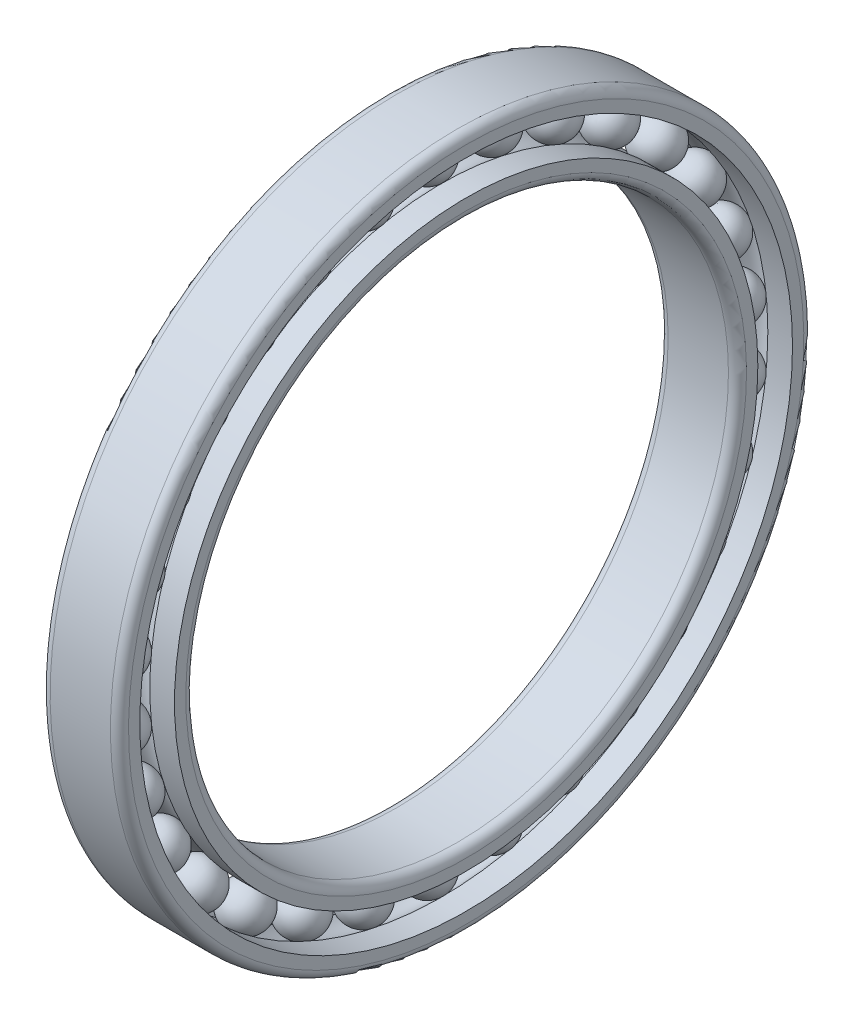
ISO-10303-21;
HEADER;
FILE_DESCRIPTION(('STEP AP214'),'2;1');
FILE_NAME('part.step','',(''),(''),'','','');
FILE_SCHEMA(('AUTOMOTIVE_DESIGN { 1 0 10303 214 1 1 1 1 }'));
ENDSEC;
DATA;
#1=APPLICATION_CONTEXT('core data for automotive mechanical design processes');
#2=APPLICATION_PROTOCOL_DEFINITION('international standard','automotive_design',2000,#1);
#3=PRODUCT_CONTEXT('',#1,'mechanical');
#4=PRODUCT('Part','Part','',(#3));
#5=PRODUCT_RELATED_PRODUCT_CATEGORY('part','',(#4));
#6=PRODUCT_DEFINITION_FORMATION('','',#4);
#7=PRODUCT_DEFINITION_CONTEXT('part definition',#1,'design');
#8=PRODUCT_DEFINITION('design','',#6,#7);
#9=PRODUCT_DEFINITION_SHAPE('','',#8);
#10=(LENGTH_UNIT() NAMED_UNIT(*) SI_UNIT(.MILLI.,.METRE.));
#11=(NAMED_UNIT(*) PLANE_ANGLE_UNIT() SI_UNIT($,.RADIAN.));
#12=(NAMED_UNIT(*) SI_UNIT($,.STERADIAN.) SOLID_ANGLE_UNIT());
#13=UNCERTAINTY_MEASURE_WITH_UNIT(LENGTH_MEASURE(1.E-05),#10,'distance_accuracy_value','');
#14=(GEOMETRIC_REPRESENTATION_CONTEXT(3) GLOBAL_UNCERTAINTY_ASSIGNED_CONTEXT((#13)) GLOBAL_UNIT_ASSIGNED_CONTEXT((#10,
#11,#12)) REPRESENTATION_CONTEXT('',''));
#15=CARTESIAN_POINT('',(0.,0.,0.));
#16=DIRECTION('',(0.,0.,1.));
#17=DIRECTION('',(1.,0.,0.));
#18=AXIS2_PLACEMENT_3D('',#15,#16,#17);
#19=CARTESIAN_POINT('',(0.,41.4621209617161,30.1239941799892));
#20=DIRECTION('',(1.,0.,0.));
#21=DIRECTION('',(0.,-0.587785252292473,0.809016994374948));
#22=AXIS2_PLACEMENT_3D('',#19,#20,#21);
#23=SPHERICAL_SURFACE('',#22,3.75);
#24=CARTESIAN_POINT('',(-3.74999999999999,41.4621209617161,30.1239941799892));
#25=VERTEX_POINT('',#24);
#26=VERTEX_LOOP('',#25);
#27=FACE_BOUND('',#26,.T.);
#28=CARTESIAN_POINT('',(3.75000000000001,41.4621209617161,30.1239941799892));
#29=VERTEX_POINT('',#28);
#30=VERTEX_LOOP('',#29);
#31=FACE_BOUND('',#30,.T.);
#32=ADVANCED_FACE('P0_F15',(#27,#31),#23,.T.);
#33=CLOSED_SHELL('',(#32));
#34=MANIFOLD_SOLID_BREP('P0_B1',#33);
#35=CARTESIAN_POINT('',(0.,25.625,44.3838019439525));
#36=DIRECTION('',(1.,0.,0.));
#37=DIRECTION('',(0.,-0.866025403784438,0.5));
#38=AXIS2_PLACEMENT_3D('',#35,#36,#37);
#39=SPHERICAL_SURFACE('',#38,3.75);
#40=CARTESIAN_POINT('',(-3.74999999999999,25.625,44.3838019439525));
#41=VERTEX_POINT('',#40);
#42=VERTEX_LOOP('',#41);
#43=FACE_BOUND('',#42,.T.);
#44=CARTESIAN_POINT('',(3.75000000000001,25.625,44.3838019439525));
#45=VERTEX_POINT('',#44);
#46=VERTEX_LOOP('',#45);
#47=FACE_BOUND('',#46,.T.);
#48=ADVANCED_FACE('P1_F15',(#43,#47),#39,.T.);
#49=CLOSED_SHELL('',(#48));
#50=MANIFOLD_SOLID_BREP('P1_B1',#49);
#51=CARTESIAN_POINT('',(0.,-46.8192047041833,20.8452529576348));
#52=DIRECTION('',(1.,0.,0.));
#53=DIRECTION('',(0.,-0.4067366430758,-0.913545457642601));
#54=AXIS2_PLACEMENT_3D('',#51,#52,#53);
#55=SPHERICAL_SURFACE('',#54,3.75);
#56=CARTESIAN_POINT('',(-3.74999999999999,-46.8192047041833,20.8452529576348));
#57=VERTEX_POINT('',#56);
#58=VERTEX_LOOP('',#57);
#59=FACE_BOUND('',#58,.T.);
#60=CARTESIAN_POINT('',(3.75000000000001,-46.8192047041833,20.8452529576348));
#61=VERTEX_POINT('',#60);
#62=VERTEX_LOOP('',#61);
#63=FACE_BOUND('',#62,.T.);
#64=ADVANCED_FACE('P2_F15',(#59,#63),#55,.T.);
#65=CLOSED_SHELL('',(#64));
#66=MANIFOLD_SOLID_BREP('P2_B1',#65);
#67=CARTESIAN_POINT('',(0.,-51.25,0.));
#68=DIRECTION('',(1.,0.,0.));
#69=DIRECTION('',(0.,0.,-1.));
#70=AXIS2_PLACEMENT_3D('',#67,#68,#69);
#71=SPHERICAL_SURFACE('',#70,3.75);
#72=CARTESIAN_POINT('',(-3.74999999999999,-51.25,0.));
#73=VERTEX_POINT('',#72);
#74=VERTEX_LOOP('',#73);
#75=FACE_BOUND('',#74,.T.);
#76=CARTESIAN_POINT('',(3.75000000000001,-51.25,0.));
#77=VERTEX_POINT('',#76);
#78=VERTEX_LOOP('',#77);
#79=FACE_BOUND('',#78,.T.);
#80=ADVANCED_FACE('P3_F15',(#75,#79),#71,.T.);
#81=CLOSED_SHELL('',(#80));
#82=MANIFOLD_SOLID_BREP('P3_B1',#81);
#83=CARTESIAN_POINT('',(0.,-46.8192047041833,-20.8452529576348));
#84=DIRECTION('',(1.,0.,0.));
#85=DIRECTION('',(0.,0.4067366430758,-0.913545457642601));
#86=AXIS2_PLACEMENT_3D('',#83,#84,#85);
#87=SPHERICAL_SURFACE('',#86,3.75);
#88=CARTESIAN_POINT('',(-3.74999999999999,-46.8192047041833,-20.8452529576348));
#89=VERTEX_POINT('',#88);
#90=VERTEX_LOOP('',#89);
#91=FACE_BOUND('',#90,.T.);
#92=CARTESIAN_POINT('',(3.75000000000001,-46.8192047041833,-20.8452529576348));
#93=VERTEX_POINT('',#92);
#94=VERTEX_LOOP('',#93);
#95=FACE_BOUND('',#94,.T.);
#96=ADVANCED_FACE('P4_F15',(#91,#95),#87,.T.);
#97=CLOSED_SHELL('',(#96));
#98=MANIFOLD_SOLID_BREP('P4_B1',#97);
#99=CARTESIAN_POINT('',(0.,-41.4621209617161,-30.1239941799892));
#100=DIRECTION('',(1.,0.,0.));
#101=DIRECTION('',(0.,0.587785252292473,-0.809016994374948));
#102=AXIS2_PLACEMENT_3D('',#99,#100,#101);
#103=SPHERICAL_SURFACE('',#102,3.75);
#104=CARTESIAN_POINT('',(-3.74999999999999,-41.4621209617161,-30.1239941799892));
#105=VERTEX_POINT('',#104);
#106=VERTEX_LOOP('',#105);
#107=FACE_BOUND('',#106,.T.);
#108=CARTESIAN_POINT('',(3.75000000000001,-41.4621209617161,-30.1239941799892));
#109=VERTEX_POINT('',#108);
#110=VERTEX_LOOP('',#109);
#111=FACE_BOUND('',#110,.T.);
#112=ADVANCED_FACE('P5_F15',(#107,#111),#103,.T.);
#113=CLOSED_SHELL('',(#112));
#114=MANIFOLD_SOLID_BREP('P5_B1',#113);
#115=CARTESIAN_POINT('',(0.,-34.2929435758915,-38.0861723057165));
#116=DIRECTION('',(1.,0.,0.));
#117=DIRECTION('',(0.,0.743144825477394,-0.669130606358858));
#118=AXIS2_PLACEMENT_3D('',#115,#116,#117);
#119=SPHERICAL_SURFACE('',#118,3.75);
#120=CARTESIAN_POINT('',(-3.74999999999999,-34.2929435758915,-38.0861723057165));
#121=VERTEX_POINT('',#120);
#122=VERTEX_LOOP('',#121);
#123=FACE_BOUND('',#122,.T.);
#124=CARTESIAN_POINT('',(3.75000000000001,-34.2929435758915,-38.0861723057165));
#125=VERTEX_POINT('',#124);
#126=VERTEX_LOOP('',#125);
#127=FACE_BOUND('',#126,.T.);
#128=ADVANCED_FACE('P6_F15',(#123,#127),#119,.T.);
#129=CLOSED_SHELL('',(#128));
#130=MANIFOLD_SOLID_BREP('P6_B1',#129);
#131=CARTESIAN_POINT('',(0.,-25.625,-44.3838019439525));
#132=DIRECTION('',(1.,0.,0.));
#133=DIRECTION('',(0.,0.866025403784438,-0.5));
#134=AXIS2_PLACEMENT_3D('',#131,#132,#133);
#135=SPHERICAL_SURFACE('',#134,3.75);
#136=CARTESIAN_POINT('',(-3.74999999999999,-25.625,-44.3838019439525));
#137=VERTEX_POINT('',#136);
#138=VERTEX_LOOP('',#137);
#139=FACE_BOUND('',#138,.T.);
#140=CARTESIAN_POINT('',(3.75000000000001,-25.625,-44.3838019439525));
#141=VERTEX_POINT('',#140);
#142=VERTEX_LOOP('',#141);
#143=FACE_BOUND('',#142,.T.);
#144=ADVANCED_FACE('P7_F15',(#139,#143),#135,.T.);
#145=CLOSED_SHELL('',(#144));
#146=MANIFOLD_SOLID_BREP('P7_B1',#145);
#147=CARTESIAN_POINT('',(0.,-15.8371209617161,-48.7416464601266));
#148=DIRECTION('',(1.,0.,0.));
#149=DIRECTION('',(0.,0.951056516295154,-0.309016994374948));
#150=AXIS2_PLACEMENT_3D('',#147,#148,#149);
#151=SPHERICAL_SURFACE('',#150,3.75);
#152=CARTESIAN_POINT('',(-3.74999999999999,-15.8371209617161,-48.7416464601266));
#153=VERTEX_POINT('',#152);
#154=VERTEX_LOOP('',#153);
#155=FACE_BOUND('',#154,.T.);
#156=CARTESIAN_POINT('',(3.75000000000001,-15.8371209617161,-48.7416464601266));
#157=VERTEX_POINT('',#156);
#158=VERTEX_LOOP('',#157);
#159=FACE_BOUND('',#158,.T.);
#160=ADVANCED_FACE('P8_F15',(#155,#159),#151,.T.);
#161=CLOSED_SHELL('',(#160));
#162=MANIFOLD_SOLID_BREP('P8_B1',#161);
#163=CARTESIAN_POINT('',(0.,-5.35708374246727,-50.969247137624));
#164=DIRECTION('',(1.,0.,0.));
#165=DIRECTION('',(0.,0.994521895368273,-0.104528463267654));
#166=AXIS2_PLACEMENT_3D('',#163,#164,#165);
#167=SPHERICAL_SURFACE('',#166,3.75);
#168=CARTESIAN_POINT('',(-3.74999999999999,-5.35708374246727,-50.969247137624));
#169=VERTEX_POINT('',#168);
#170=VERTEX_LOOP('',#169);
#171=FACE_BOUND('',#170,.T.);
#172=CARTESIAN_POINT('',(3.75000000000001,-5.35708374246727,-50.969247137624));
#173=VERTEX_POINT('',#172);
#174=VERTEX_LOOP('',#173);
#175=FACE_BOUND('',#174,.T.);
#176=ADVANCED_FACE('P9_F15',(#171,#175),#167,.T.);
#177=CLOSED_SHELL('',(#176));
#178=MANIFOLD_SOLID_BREP('P9_B1',#177);
#179=CARTESIAN_POINT('',(0.,5.35708374246722,-50.969247137624));
#180=DIRECTION('',(1.,0.,0.));
#181=DIRECTION('',(0.,0.994521895368273,0.104528463267653));
#182=AXIS2_PLACEMENT_3D('',#179,#180,#181);
#183=SPHERICAL_SURFACE('',#182,3.75);
#184=CARTESIAN_POINT('',(-3.74999999999999,5.35708374246722,-50.969247137624));
#185=VERTEX_POINT('',#184);
#186=VERTEX_LOOP('',#185);
#187=FACE_BOUND('',#186,.T.);
#188=CARTESIAN_POINT('',(3.75000000000001,5.35708374246722,-50.969247137624));
#189=VERTEX_POINT('',#188);
#190=VERTEX_LOOP('',#189);
#191=FACE_BOUND('',#190,.T.);
#192=ADVANCED_FACE('P10_F15',(#187,#191),#183,.T.);
#193=CLOSED_SHELL('',(#192));
#194=MANIFOLD_SOLID_BREP('P10_B1',#193);
#195=CARTESIAN_POINT('',(0.,15.837120961716,-48.7416464601266));
#196=DIRECTION('',(1.,0.,0.));
#197=DIRECTION('',(0.,0.951056516295154,0.309016994374947));
#198=AXIS2_PLACEMENT_3D('',#195,#196,#197);
#199=SPHERICAL_SURFACE('',#198,3.75);
#200=CARTESIAN_POINT('',(-3.74999999999999,15.837120961716,-48.7416464601266));
#201=VERTEX_POINT('',#200);
#202=VERTEX_LOOP('',#201);
#203=FACE_BOUND('',#202,.T.);
#204=CARTESIAN_POINT('',(3.75000000000001,15.837120961716,-48.7416464601266));
#205=VERTEX_POINT('',#204);
#206=VERTEX_LOOP('',#205);
#207=FACE_BOUND('',#206,.T.);
#208=ADVANCED_FACE('P11_F15',(#203,#207),#199,.T.);
#209=CLOSED_SHELL('',(#208));
#210=MANIFOLD_SOLID_BREP('P11_B1',#209);
#211=CARTESIAN_POINT('',(0.,25.625,-44.3838019439525));
#212=DIRECTION('',(1.,0.,0.));
#213=DIRECTION('',(0.,0.866025403784439,0.5));
#214=AXIS2_PLACEMENT_3D('',#211,#212,#213);
#215=SPHERICAL_SURFACE('',#214,3.75);
#216=CARTESIAN_POINT('',(-3.74999999999999,25.625,-44.3838019439525));
#217=VERTEX_POINT('',#216);
#218=VERTEX_LOOP('',#217);
#219=FACE_BOUND('',#218,.T.);
#220=CARTESIAN_POINT('',(3.75000000000001,25.625,-44.3838019439525));
#221=VERTEX_POINT('',#220);
#222=VERTEX_LOOP('',#221);
#223=FACE_BOUND('',#222,.T.);
#224=ADVANCED_FACE('P12_F15',(#219,#223),#215,.T.);
#225=CLOSED_SHELL('',(#224));
#226=MANIFOLD_SOLID_BREP('P12_B1',#225);
#227=CARTESIAN_POINT('',(0.,34.2929435758915,-38.0861723057165));
#228=DIRECTION('',(1.,0.,0.));
#229=DIRECTION('',(0.,0.743144825477394,0.669130606358858));
#230=AXIS2_PLACEMENT_3D('',#227,#228,#229);
#231=SPHERICAL_SURFACE('',#230,3.75);
#232=CARTESIAN_POINT('',(-3.74999999999999,34.2929435758915,-38.0861723057165));
#233=VERTEX_POINT('',#232);
#234=VERTEX_LOOP('',#233);
#235=FACE_BOUND('',#234,.T.);
#236=CARTESIAN_POINT('',(3.75000000000001,34.2929435758915,-38.0861723057165));
#237=VERTEX_POINT('',#236);
#238=VERTEX_LOOP('',#237);
#239=FACE_BOUND('',#238,.T.);
#240=ADVANCED_FACE('P13_F15',(#235,#239),#231,.T.);
#241=CLOSED_SHELL('',(#240));
#242=MANIFOLD_SOLID_BREP('P13_B1',#241);
#243=CARTESIAN_POINT('',(0.,41.4621209617161,-30.1239941799893));
#244=DIRECTION('',(1.,0.,0.));
#245=DIRECTION('',(0.,0.587785252292473,0.809016994374947));
#246=AXIS2_PLACEMENT_3D('',#243,#244,#245);
#247=SPHERICAL_SURFACE('',#246,3.75);
#248=CARTESIAN_POINT('',(-3.74999999999999,41.4621209617161,-30.1239941799893));
#249=VERTEX_POINT('',#248);
#250=VERTEX_LOOP('',#249);
#251=FACE_BOUND('',#250,.T.);
#252=CARTESIAN_POINT('',(3.75000000000001,41.4621209617161,-30.1239941799893));
#253=VERTEX_POINT('',#252);
#254=VERTEX_LOOP('',#253);
#255=FACE_BOUND('',#254,.T.);
#256=ADVANCED_FACE('P14_F15',(#251,#255),#247,.T.);
#257=CLOSED_SHELL('',(#256));
#258=MANIFOLD_SOLID_BREP('P14_B1',#257);
#259=CARTESIAN_POINT('',(0.,46.8192047041833,-20.8452529576348));
#260=DIRECTION('',(1.,0.,0.));
#261=DIRECTION('',(0.,0.4067366430758,0.913545457642601));
#262=AXIS2_PLACEMENT_3D('',#259,#260,#261);
#263=SPHERICAL_SURFACE('',#262,3.75);
#264=CARTESIAN_POINT('',(-3.74999999999999,46.8192047041833,-20.8452529576348));
#265=VERTEX_POINT('',#264);
#266=VERTEX_LOOP('',#265);
#267=FACE_BOUND('',#266,.T.);
#268=CARTESIAN_POINT('',(3.75000000000001,46.8192047041833,-20.8452529576348));
#269=VERTEX_POINT('',#268);
#270=VERTEX_LOOP('',#269);
#271=FACE_BOUND('',#270,.T.);
#272=ADVANCED_FACE('P15_F15',(#267,#271),#263,.T.);
#273=CLOSED_SHELL('',(#272));
#274=MANIFOLD_SOLID_BREP('P15_B1',#273);
#275=CARTESIAN_POINT('',(0.,50.1300645376076,-10.6554741544101));
#276=DIRECTION('',(1.,0.,0.));
#277=DIRECTION('',(0.,0.207911690817759,0.978147600733806));
#278=AXIS2_PLACEMENT_3D('',#275,#276,#277);
#279=SPHERICAL_SURFACE('',#278,3.75);
#280=CARTESIAN_POINT('',(-3.74999999999999,50.1300645376076,-10.6554741544101));
#281=VERTEX_POINT('',#280);
#282=VERTEX_LOOP('',#281);
#283=FACE_BOUND('',#282,.T.);
#284=CARTESIAN_POINT('',(3.75000000000001,50.1300645376076,-10.6554741544101));
#285=VERTEX_POINT('',#284);
#286=VERTEX_LOOP('',#285);
#287=FACE_BOUND('',#286,.T.);
#288=ADVANCED_FACE('P16_F15',(#283,#287),#279,.T.);
#289=CLOSED_SHELL('',(#288));
#290=MANIFOLD_SOLID_BREP('P16_B1',#289);
#291=CARTESIAN_POINT('',(0.,51.25,0.));
#292=DIRECTION('',(1.,0.,0.));
#293=DIRECTION('',(0.,0.,1.));
#294=AXIS2_PLACEMENT_3D('',#291,#292,#293);
#295=SPHERICAL_SURFACE('',#294,3.75);
#296=CARTESIAN_POINT('',(-3.74999999999999,51.25,0.));
#297=VERTEX_POINT('',#296);
#298=VERTEX_LOOP('',#297);
#299=FACE_BOUND('',#298,.T.);
#300=CARTESIAN_POINT('',(3.75000000000001,51.25,0.));
#301=VERTEX_POINT('',#300);
#302=VERTEX_LOOP('',#301);
#303=FACE_BOUND('',#302,.T.);
#304=ADVANCED_FACE('P17_F15',(#299,#303),#295,.T.);
#305=CLOSED_SHELL('',(#304));
#306=MANIFOLD_SOLID_BREP('P17_B1',#305);
#307=CARTESIAN_POINT('',(0.,0.,0.));
#308=DIRECTION('',(1.,0.,0.));
#309=DIRECTION('',(0.,1.,0.));
#310=AXIS2_PLACEMENT_3D('',#307,#308,#309);
#311=TOROIDAL_SURFACE('',#310,51.25,3.75);
#312=CARTESIAN_POINT('',(-2.40767003553228,0.,0.));
#313=DIRECTION('',(1.,0.,0.));
#314=DIRECTION('',(0.,0.,-1.));
#315=AXIS2_PLACEMENT_3D('',#312,#313,#314);
#316=CIRCLE('',#315,54.125);
#317=CARTESIAN_POINT('',(-2.40767003553228,0.,-54.125));
#318=VERTEX_POINT('',#317);
#319=EDGE_CURVE('P18_E109',#318,#318,#316,.F.);
#320=ORIENTED_EDGE('',*,*,#319,.T.);
#321=EDGE_LOOP('',(#320));
#322=FACE_BOUND('',#321,.T.);
#323=CARTESIAN_POINT('',(2.40767003553228,0.,0.));
#324=DIRECTION('',(1.,0.,0.));
#325=DIRECTION('',(0.,0.,-1.));
#326=AXIS2_PLACEMENT_3D('',#323,#324,#325);
#327=CIRCLE('',#326,54.125);
#328=CARTESIAN_POINT('',(2.40767003553228,0.,-54.125));
#329=VERTEX_POINT('',#328);
#330=EDGE_CURVE('P18_E114',#329,#329,#327,.T.);
#331=ORIENTED_EDGE('',*,*,#330,.T.);
#332=EDGE_LOOP('',(#331));
#333=FACE_BOUND('',#332,.T.);
#334=ADVANCED_FACE('P18_F14',(#322,#333),#311,.F.);
#335=CARTESIAN_POINT('',(6.50000000000002,0.,0.));
#336=DIRECTION('',(1.,0.,0.));
#337=DIRECTION('',(0.,0.,-1.));
#338=AXIS2_PLACEMENT_3D('',#335,#336,#337);
#339=CYLINDRICAL_SURFACE('',#338,54.125);
#340=ORIENTED_EDGE('',*,*,#330,.F.);
#341=EDGE_LOOP('',(#340));
#342=FACE_BOUND('',#341,.T.);
#343=CARTESIAN_POINT('',(6.50000000000002,0.,0.));
#344=DIRECTION('',(1.,0.,0.));
#345=DIRECTION('',(0.,0.,-1.));
#346=AXIS2_PLACEMENT_3D('',#343,#344,#345);
#347=CIRCLE('',#346,54.125);
#348=CARTESIAN_POINT('',(6.50000000000002,0.,-54.125));
#349=VERTEX_POINT('',#348);
#350=EDGE_CURVE('P18_E18',#349,#349,#347,.F.);
#351=ORIENTED_EDGE('',*,*,#350,.F.);
#352=EDGE_LOOP('',(#351));
#353=FACE_BOUND('',#352,.T.);
#354=ADVANCED_FACE('P18_F85',(#342,#353),#339,.F.);
#355=CARTESIAN_POINT('',(6.50000000000002,0.,0.));
#356=DIRECTION('',(1.,0.,0.));
#357=DIRECTION('',(0.,0.,-1.));
#358=AXIS2_PLACEMENT_3D('',#355,#356,#357);
#359=CYLINDRICAL_SURFACE('',#358,54.125);
#360=CARTESIAN_POINT('',(-6.49999999999999,0.,0.));
#361=DIRECTION('',(1.,0.,0.));
#362=DIRECTION('',(0.,0.,-1.));
#363=AXIS2_PLACEMENT_3D('',#360,#361,#362);
#364=CIRCLE('',#363,54.125);
#365=CARTESIAN_POINT('',(-6.49999999999999,0.,-54.125));
#366=VERTEX_POINT('',#365);
#367=EDGE_CURVE('P18_E104',#366,#366,#364,.T.);
#368=ORIENTED_EDGE('',*,*,#367,.F.);
#369=EDGE_LOOP('',(#368));
#370=FACE_BOUND('',#369,.T.);
#371=ORIENTED_EDGE('',*,*,#319,.F.);
#372=EDGE_LOOP('',(#371));
#373=FACE_BOUND('',#372,.T.);
#374=ADVANCED_FACE('P18_F81',(#370,#373),#359,.F.);
#375=CARTESIAN_POINT('',(6.50000000000002,0.,0.));
#376=DIRECTION('',(1.,0.,0.));
#377=DIRECTION('',(0.,0.,-1.));
#378=AXIS2_PLACEMENT_3D('',#375,#376,#377);
#379=PLANE('',#378);
#380=ORIENTED_EDGE('',*,*,#350,.T.);
#381=EDGE_LOOP('',(#380));
#382=FACE_BOUND('',#381,.T.);
#383=CARTESIAN_POINT('',(6.50000000000002,0.,0.));
#384=DIRECTION('',(-1.,0.,0.));
#385=DIRECTION('',(0.,1.,0.));
#386=AXIS2_PLACEMENT_3D('',#383,#384,#385);
#387=CIRCLE('',#386,56.);
#388=CARTESIAN_POINT('',(6.50000000000002,56.,0.));
#389=VERTEX_POINT('',#388);
#390=EDGE_CURVE('P18_E65',#389,#389,#387,.T.);
#391=ORIENTED_EDGE('',*,*,#390,.F.);
#392=EDGE_LOOP('',(#391));
#393=FACE_BOUND('',#392,.T.);
#394=ADVANCED_FACE('P18_F71',(#382,#393),#379,.T.);
#395=CARTESIAN_POINT('',(-6.49999999999999,0.,0.));
#396=DIRECTION('',(-1.,0.,0.));
#397=DIRECTION('',(0.,0.,1.));
#398=AXIS2_PLACEMENT_3D('',#395,#396,#397);
#399=PLANE('',#398);
#400=ORIENTED_EDGE('',*,*,#367,.T.);
#401=EDGE_LOOP('',(#400));
#402=FACE_BOUND('',#401,.T.);
#403=CARTESIAN_POINT('',(-6.49999999999999,0.,0.));
#404=DIRECTION('',(1.,0.,0.));
#405=DIRECTION('',(0.,1.,0.));
#406=AXIS2_PLACEMENT_3D('',#403,#404,#405);
#407=CIRCLE('',#406,56.);
#408=CARTESIAN_POINT('',(-6.49999999999999,56.,0.));
#409=VERTEX_POINT('',#408);
#410=EDGE_CURVE('P18_E27',#409,#409,#407,.T.);
#411=ORIENTED_EDGE('',*,*,#410,.F.);
#412=EDGE_LOOP('',(#411));
#413=FACE_BOUND('',#412,.T.);
#414=ADVANCED_FACE('P18_F80',(#402,#413),#399,.T.);
#415=CARTESIAN_POINT('',(5.00000000000002,0.,0.));
#416=DIRECTION('',(1.,0.,0.));
#417=DIRECTION('',(0.,1.,0.));
#418=AXIS2_PLACEMENT_3D('',#415,#416,#417);
#419=TOROIDAL_SURFACE('',#418,56.,1.5);
#420=CARTESIAN_POINT('',(5.00000000000002,0.,0.));
#421=DIRECTION('',(1.,0.,0.));
#422=DIRECTION('',(0.,0.,-1.));
#423=AXIS2_PLACEMENT_3D('',#420,#421,#422);
#424=CIRCLE('',#423,57.5);
#425=CARTESIAN_POINT('',(5.00000000000002,0.,-57.5));
#426=VERTEX_POINT('',#425);
#427=EDGE_CURVE('P18_E22',#426,#426,#424,.F.);
#428=ORIENTED_EDGE('',*,*,#427,.F.);
#429=EDGE_LOOP('',(#428));
#430=FACE_BOUND('',#429,.T.);
#431=ORIENTED_EDGE('',*,*,#390,.T.);
#432=EDGE_LOOP('',(#431));
#433=FACE_BOUND('',#432,.T.);
#434=ADVANCED_FACE('P18_F45',(#430,#433),#419,.T.);
#435=CARTESIAN_POINT('',(-4.99999999999999,0.,0.));
#436=DIRECTION('',(1.,0.,0.));
#437=DIRECTION('',(0.,1.,0.));
#438=AXIS2_PLACEMENT_3D('',#435,#436,#437);
#439=TOROIDAL_SURFACE('',#438,56.,1.5);
#440=ORIENTED_EDGE('',*,*,#410,.T.);
#441=EDGE_LOOP('',(#440));
#442=FACE_BOUND('',#441,.T.);
#443=CARTESIAN_POINT('',(-4.99999999999999,0.,0.));
#444=DIRECTION('',(1.,0.,0.));
#445=DIRECTION('',(0.,0.,-1.));
#446=AXIS2_PLACEMENT_3D('',#443,#444,#445);
#447=CIRCLE('',#446,57.5);
#448=CARTESIAN_POINT('',(-4.99999999999999,0.,-57.5));
#449=VERTEX_POINT('',#448);
#450=EDGE_CURVE('P18_E10',#449,#449,#447,.T.);
#451=ORIENTED_EDGE('',*,*,#450,.F.);
#452=EDGE_LOOP('',(#451));
#453=FACE_BOUND('',#452,.T.);
#454=ADVANCED_FACE('P18_F39',(#442,#453),#439,.T.);
#455=CARTESIAN_POINT('',(-6.49999999999999,0.,0.));
#456=DIRECTION('',(1.,0.,0.));
#457=DIRECTION('',(0.,0.,-1.));
#458=AXIS2_PLACEMENT_3D('',#455,#456,#457);
#459=CYLINDRICAL_SURFACE('',#458,57.5);
#460=ORIENTED_EDGE('',*,*,#450,.T.);
#461=EDGE_LOOP('',(#460));
#462=FACE_BOUND('',#461,.T.);
#463=ORIENTED_EDGE('',*,*,#427,.T.);
#464=EDGE_LOOP('',(#463));
#465=FACE_BOUND('',#464,.T.);
#466=ADVANCED_FACE('P18_F44',(#462,#465),#459,.T.);
#467=CLOSED_SHELL('',(#334,#354,#374,#394,#414,#434,#454,#466));
#468=MANIFOLD_SOLID_BREP('P18_B1',#467);
#469=CARTESIAN_POINT('',(0.,0.,0.));
#470=DIRECTION('',(1.,0.,0.));
#471=DIRECTION('',(0.,1.,0.));
#472=AXIS2_PLACEMENT_3D('',#469,#470,#471);
#473=TOROIDAL_SURFACE('',#472,51.25,3.75);
#474=CARTESIAN_POINT('',(-2.40767003553229,0.,0.));
#475=DIRECTION('',(1.,0.,0.));
#476=DIRECTION('',(0.,0.,-1.));
#477=AXIS2_PLACEMENT_3D('',#474,#475,#476);
#478=CIRCLE('',#477,48.375);
#479=CARTESIAN_POINT('',(-2.40767003553229,0.,-48.375));
#480=VERTEX_POINT('',#479);
#481=EDGE_CURVE('P19_E109',#480,#480,#478,.F.);
#482=ORIENTED_EDGE('',*,*,#481,.F.);
#483=EDGE_LOOP('',(#482));
#484=FACE_BOUND('',#483,.T.);
#485=CARTESIAN_POINT('',(2.40767003553228,0.,0.));
#486=DIRECTION('',(1.,0.,0.));
#487=DIRECTION('',(0.,0.,-1.));
#488=AXIS2_PLACEMENT_3D('',#485,#486,#487);
#489=CIRCLE('',#488,48.375);
#490=CARTESIAN_POINT('',(2.40767003553228,0.,-48.375));
#491=VERTEX_POINT('',#490);
#492=EDGE_CURVE('P19_E114',#491,#491,#489,.T.);
#493=ORIENTED_EDGE('',*,*,#492,.F.);
#494=EDGE_LOOP('',(#493));
#495=FACE_BOUND('',#494,.T.);
#496=ADVANCED_FACE('P19_F14',(#484,#495),#473,.F.);
#497=CARTESIAN_POINT('',(-6.49999999999999,0.,0.));
#498=DIRECTION('',(1.,0.,0.));
#499=DIRECTION('',(0.,0.,-1.));
#500=AXIS2_PLACEMENT_3D('',#497,#498,#499);
#501=CYLINDRICAL_SURFACE('',#500,48.375);
#502=ORIENTED_EDGE('',*,*,#492,.T.);
#503=EDGE_LOOP('',(#502));
#504=FACE_BOUND('',#503,.T.);
#505=CARTESIAN_POINT('',(6.5,0.,0.));
#506=DIRECTION('',(1.,0.,0.));
#507=DIRECTION('',(0.,0.,-1.));
#508=AXIS2_PLACEMENT_3D('',#505,#506,#507);
#509=CIRCLE('',#508,48.375);
#510=CARTESIAN_POINT('',(6.5,0.,-48.375));
#511=VERTEX_POINT('',#510);
#512=EDGE_CURVE('P19_E18',#511,#511,#509,.T.);
#513=ORIENTED_EDGE('',*,*,#512,.F.);
#514=EDGE_LOOP('',(#513));
#515=FACE_BOUND('',#514,.T.);
#516=ADVANCED_FACE('P19_F84',(#504,#515),#501,.T.);
#517=CARTESIAN_POINT('',(-6.49999999999999,0.,0.));
#518=DIRECTION('',(1.,0.,0.));
#519=DIRECTION('',(0.,0.,-1.));
#520=AXIS2_PLACEMENT_3D('',#517,#518,#519);
#521=CYLINDRICAL_SURFACE('',#520,48.375);
#522=CARTESIAN_POINT('',(-6.49999999999999,0.,0.));
#523=DIRECTION('',(1.,0.,0.));
#524=DIRECTION('',(0.,0.,-1.));
#525=AXIS2_PLACEMENT_3D('',#522,#523,#524);
#526=CIRCLE('',#525,48.375);
#527=CARTESIAN_POINT('',(-6.49999999999999,0.,-48.375));
#528=VERTEX_POINT('',#527);
#529=EDGE_CURVE('P19_E104',#528,#528,#526,.F.);
#530=ORIENTED_EDGE('',*,*,#529,.F.);
#531=EDGE_LOOP('',(#530));
#532=FACE_BOUND('',#531,.T.);
#533=ORIENTED_EDGE('',*,*,#481,.T.);
#534=EDGE_LOOP('',(#533));
#535=FACE_BOUND('',#534,.T.);
#536=ADVANCED_FACE('P19_F81',(#532,#535),#521,.T.);
#537=CARTESIAN_POINT('',(6.50000000000001,0.,0.));
#538=DIRECTION('',(1.,0.,0.));
#539=DIRECTION('',(0.,0.,-1.));
#540=AXIS2_PLACEMENT_3D('',#537,#538,#539);
#541=PLANE('',#540);
#542=CARTESIAN_POINT('',(6.50000000000001,0.,0.));
#543=DIRECTION('',(1.,0.,0.));
#544=DIRECTION('',(0.,1.,0.));
#545=AXIS2_PLACEMENT_3D('',#542,#543,#544);
#546=CIRCLE('',#545,46.5);
#547=CARTESIAN_POINT('',(6.50000000000001,46.5,0.));
#548=VERTEX_POINT('',#547);
#549=EDGE_CURVE('P19_E65',#548,#548,#546,.T.);
#550=ORIENTED_EDGE('',*,*,#549,.F.);
#551=EDGE_LOOP('',(#550));
#552=FACE_BOUND('',#551,.T.);
#553=ORIENTED_EDGE('',*,*,#512,.T.);
#554=EDGE_LOOP('',(#553));
#555=FACE_BOUND('',#554,.T.);
#556=ADVANCED_FACE('P19_F71',(#552,#555),#541,.T.);
#557=CARTESIAN_POINT('',(-6.49999999999999,0.,0.));
#558=DIRECTION('',(-1.,0.,0.));
#559=DIRECTION('',(0.,0.,1.));
#560=AXIS2_PLACEMENT_3D('',#557,#558,#559);
#561=PLANE('',#560);
#562=CARTESIAN_POINT('',(-6.49999999999999,0.,0.));
#563=DIRECTION('',(-1.,0.,0.));
#564=DIRECTION('',(0.,1.,0.));
#565=AXIS2_PLACEMENT_3D('',#562,#563,#564);
#566=CIRCLE('',#565,46.5);
#567=CARTESIAN_POINT('',(-6.49999999999999,46.5,0.));
#568=VERTEX_POINT('',#567);
#569=EDGE_CURVE('P19_E27',#568,#568,#566,.T.);
#570=ORIENTED_EDGE('',*,*,#569,.F.);
#571=EDGE_LOOP('',(#570));
#572=FACE_BOUND('',#571,.T.);
#573=ORIENTED_EDGE('',*,*,#529,.T.);
#574=EDGE_LOOP('',(#573));
#575=FACE_BOUND('',#574,.T.);
#576=ADVANCED_FACE('P19_F80',(#572,#575),#561,.T.);
#577=CARTESIAN_POINT('',(5.00000000000001,0.,0.));
#578=DIRECTION('',(1.,0.,0.));
#579=DIRECTION('',(0.,1.,0.));
#580=AXIS2_PLACEMENT_3D('',#577,#578,#579);
#581=TOROIDAL_SURFACE('',#580,46.5,1.5);
#582=CARTESIAN_POINT('',(5.00000000000001,0.,0.));
#583=DIRECTION('',(1.,0.,0.));
#584=DIRECTION('',(0.,0.,-1.));
#585=AXIS2_PLACEMENT_3D('',#582,#583,#584);
#586=CIRCLE('',#585,45.);
#587=CARTESIAN_POINT('',(5.00000000000001,0.,-45.));
#588=VERTEX_POINT('',#587);
#589=EDGE_CURVE('P19_E22',#588,#588,#586,.F.);
#590=ORIENTED_EDGE('',*,*,#589,.T.);
#591=EDGE_LOOP('',(#590));
#592=FACE_BOUND('',#591,.T.);
#593=ORIENTED_EDGE('',*,*,#549,.T.);
#594=EDGE_LOOP('',(#593));
#595=FACE_BOUND('',#594,.T.);
#596=ADVANCED_FACE('P19_F45',(#592,#595),#581,.T.);
#597=CARTESIAN_POINT('',(-4.99999999999999,0.,0.));
#598=DIRECTION('',(1.,0.,0.));
#599=DIRECTION('',(0.,1.,0.));
#600=AXIS2_PLACEMENT_3D('',#597,#598,#599);
#601=TOROIDAL_SURFACE('',#600,46.5,1.5);
#602=ORIENTED_EDGE('',*,*,#569,.T.);
#603=EDGE_LOOP('',(#602));
#604=FACE_BOUND('',#603,.T.);
#605=CARTESIAN_POINT('',(-4.99999999999999,0.,0.));
#606=DIRECTION('',(1.,0.,0.));
#607=DIRECTION('',(0.,0.,-1.));
#608=AXIS2_PLACEMENT_3D('',#605,#606,#607);
#609=CIRCLE('',#608,45.);
#610=CARTESIAN_POINT('',(-4.99999999999999,0.,-45.));
#611=VERTEX_POINT('',#610);
#612=EDGE_CURVE('P19_E10',#611,#611,#609,.T.);
#613=ORIENTED_EDGE('',*,*,#612,.T.);
#614=EDGE_LOOP('',(#613));
#615=FACE_BOUND('',#614,.T.);
#616=ADVANCED_FACE('P19_F39',(#604,#615),#601,.T.);
#617=CARTESIAN_POINT('',(6.50000000000001,0.,0.));
#618=DIRECTION('',(1.,0.,0.));
#619=DIRECTION('',(0.,0.,-1.));
#620=AXIS2_PLACEMENT_3D('',#617,#618,#619);
#621=CYLINDRICAL_SURFACE('',#620,45.);
#622=ORIENTED_EDGE('',*,*,#612,.F.);
#623=EDGE_LOOP('',(#622));
#624=FACE_BOUND('',#623,.T.);
#625=ORIENTED_EDGE('',*,*,#589,.F.);
#626=EDGE_LOOP('',(#625));
#627=FACE_BOUND('',#626,.T.);
#628=ADVANCED_FACE('P19_F44',(#624,#627),#621,.F.);
#629=CLOSED_SHELL('',(#496,#516,#536,#556,#576,#596,#616,#628));
#630=MANIFOLD_SOLID_BREP('P19_B1',#629);
#631=CARTESIAN_POINT('',(0.,46.8192047041833,20.8452529576348));
#632=DIRECTION('',(1.,0.,0.));
#633=DIRECTION('',(0.,-0.4067366430758,0.913545457642601));
#634=AXIS2_PLACEMENT_3D('',#631,#632,#633);
#635=SPHERICAL_SURFACE('',#634,3.75);
#636=CARTESIAN_POINT('',(-3.74999999999999,46.8192047041833,20.8452529576348));
#637=VERTEX_POINT('',#636);
#638=VERTEX_LOOP('',#637);
#639=FACE_BOUND('',#638,.T.);
#640=CARTESIAN_POINT('',(3.75000000000001,46.8192047041833,20.8452529576348));
#641=VERTEX_POINT('',#640);
#642=VERTEX_LOOP('',#641);
#643=FACE_BOUND('',#642,.T.);
#644=ADVANCED_FACE('P20_F15',(#639,#643),#635,.T.);
#645=CLOSED_SHELL('',(#644));
#646=MANIFOLD_SOLID_BREP('P20_B1',#645);
#647=CARTESIAN_POINT('',(0.,-41.4621209617161,30.1239941799893));
#648=DIRECTION('',(1.,0.,0.));
#649=DIRECTION('',(0.,-0.587785252292473,-0.809016994374947));
#650=AXIS2_PLACEMENT_3D('',#647,#648,#649);
#651=SPHERICAL_SURFACE('',#650,3.75);
#652=CARTESIAN_POINT('',(-3.74999999999999,-41.4621209617161,30.1239941799893));
#653=VERTEX_POINT('',#652);
#654=VERTEX_LOOP('',#653);
#655=FACE_BOUND('',#654,.T.);
#656=CARTESIAN_POINT('',(3.75000000000001,-41.4621209617161,30.1239941799893));
#657=VERTEX_POINT('',#656);
#658=VERTEX_LOOP('',#657);
#659=FACE_BOUND('',#658,.T.);
#660=ADVANCED_FACE('P21_F15',(#655,#659),#651,.T.);
#661=CLOSED_SHELL('',(#660));
#662=MANIFOLD_SOLID_BREP('P21_B1',#661);
#663=CARTESIAN_POINT('',(0.,34.2929435758915,38.0861723057165));
#664=DIRECTION('',(1.,0.,0.));
#665=DIRECTION('',(0.,-0.743144825477394,0.669130606358858));
#666=AXIS2_PLACEMENT_3D('',#663,#664,#665);
#667=SPHERICAL_SURFACE('',#666,3.75);
#668=CARTESIAN_POINT('',(-3.74999999999999,34.2929435758915,38.0861723057165));
#669=VERTEX_POINT('',#668);
#670=VERTEX_LOOP('',#669);
#671=FACE_BOUND('',#670,.T.);
#672=CARTESIAN_POINT('',(3.75000000000001,34.2929435758915,38.0861723057165));
#673=VERTEX_POINT('',#672);
#674=VERTEX_LOOP('',#673);
#675=FACE_BOUND('',#674,.T.);
#676=ADVANCED_FACE('P22_F15',(#671,#675),#667,.T.);
#677=CLOSED_SHELL('',(#676));
#678=MANIFOLD_SOLID_BREP('P22_B1',#677);
#679=CARTESIAN_POINT('',(0.,15.8371209617161,48.7416464601266));
#680=DIRECTION('',(1.,0.,0.));
#681=DIRECTION('',(0.,-0.951056516295154,0.309016994374948));
#682=AXIS2_PLACEMENT_3D('',#679,#680,#681);
#683=SPHERICAL_SURFACE('',#682,3.75);
#684=CARTESIAN_POINT('',(-3.74999999999999,15.8371209617161,48.7416464601266));
#685=VERTEX_POINT('',#684);
#686=VERTEX_LOOP('',#685);
#687=FACE_BOUND('',#686,.T.);
#688=CARTESIAN_POINT('',(3.75000000000001,15.8371209617161,48.7416464601266));
#689=VERTEX_POINT('',#688);
#690=VERTEX_LOOP('',#689);
#691=FACE_BOUND('',#690,.T.);
#692=ADVANCED_FACE('P23_F15',(#687,#691),#683,.T.);
#693=CLOSED_SHELL('',(#692));
#694=MANIFOLD_SOLID_BREP('P23_B1',#693);
#695=CARTESIAN_POINT('',(0.,5.35708374246727,50.969247137624));
#696=DIRECTION('',(1.,0.,0.));
#697=DIRECTION('',(0.,-0.994521895368273,0.104528463267654));
#698=AXIS2_PLACEMENT_3D('',#695,#696,#697);
#699=SPHERICAL_SURFACE('',#698,3.75);
#700=CARTESIAN_POINT('',(-3.74999999999999,5.35708374246727,50.969247137624));
#701=VERTEX_POINT('',#700);
#702=VERTEX_LOOP('',#701);
#703=FACE_BOUND('',#702,.T.);
#704=CARTESIAN_POINT('',(3.75000000000001,5.35708374246727,50.969247137624));
#705=VERTEX_POINT('',#704);
#706=VERTEX_LOOP('',#705);
#707=FACE_BOUND('',#706,.T.);
#708=ADVANCED_FACE('P24_F15',(#703,#707),#699,.T.);
#709=CLOSED_SHELL('',(#708));
#710=MANIFOLD_SOLID_BREP('P24_B1',#709);
#711=CARTESIAN_POINT('',(0.,-50.1300645376076,10.6554741544101));
#712=DIRECTION('',(1.,0.,0.));
#713=DIRECTION('',(0.,-0.207911690817759,-0.978147600733806));
#714=AXIS2_PLACEMENT_3D('',#711,#712,#713);
#715=SPHERICAL_SURFACE('',#714,3.75);
#716=CARTESIAN_POINT('',(-3.74999999999999,-50.1300645376076,10.6554741544101));
#717=VERTEX_POINT('',#716);
#718=VERTEX_LOOP('',#717);
#719=FACE_BOUND('',#718,.T.);
#720=CARTESIAN_POINT('',(3.75000000000001,-50.1300645376076,10.6554741544101));
#721=VERTEX_POINT('',#720);
#722=VERTEX_LOOP('',#721);
#723=FACE_BOUND('',#722,.T.);
#724=ADVANCED_FACE('P25_F15',(#719,#723),#715,.T.);
#725=CLOSED_SHELL('',(#724));
#726=MANIFOLD_SOLID_BREP('P25_B1',#725);
#727=CARTESIAN_POINT('',(0.,-50.1300645376076,-10.6554741544101));
#728=DIRECTION('',(1.,0.,0.));
#729=DIRECTION('',(0.,0.207911690817759,-0.978147600733806));
#730=AXIS2_PLACEMENT_3D('',#727,#728,#729);
#731=SPHERICAL_SURFACE('',#730,3.75);
#732=CARTESIAN_POINT('',(-3.74999999999999,-50.1300645376076,-10.6554741544101));
#733=VERTEX_POINT('',#732);
#734=VERTEX_LOOP('',#733);
#735=FACE_BOUND('',#734,.T.);
#736=CARTESIAN_POINT('',(3.75000000000001,-50.1300645376076,-10.6554741544101));
#737=VERTEX_POINT('',#736);
#738=VERTEX_LOOP('',#737);
#739=FACE_BOUND('',#738,.T.);
#740=ADVANCED_FACE('P26_F15',(#735,#739),#731,.T.);
#741=CLOSED_SHELL('',(#740));
#742=MANIFOLD_SOLID_BREP('P26_B1',#741);
#743=CARTESIAN_POINT('',(0.,-5.35708374246722,50.969247137624));
#744=DIRECTION('',(1.,0.,0.));
#745=DIRECTION('',(0.,-0.994521895368273,-0.104528463267653));
#746=AXIS2_PLACEMENT_3D('',#743,#744,#745);
#747=SPHERICAL_SURFACE('',#746,3.75);
#748=CARTESIAN_POINT('',(-3.74999999999999,-5.35708374246722,50.969247137624));
#749=VERTEX_POINT('',#748);
#750=VERTEX_LOOP('',#749);
#751=FACE_BOUND('',#750,.T.);
#752=CARTESIAN_POINT('',(3.75000000000001,-5.35708374246722,50.969247137624));
#753=VERTEX_POINT('',#752);
#754=VERTEX_LOOP('',#753);
#755=FACE_BOUND('',#754,.T.);
#756=ADVANCED_FACE('P27_F15',(#751,#755),#747,.T.);
#757=CLOSED_SHELL('',(#756));
#758=MANIFOLD_SOLID_BREP('P27_B1',#757);
#759=CARTESIAN_POINT('',(0.,50.1300645376076,10.6554741544101));
#760=DIRECTION('',(1.,0.,0.));
#761=DIRECTION('',(0.,-0.207911690817759,0.978147600733806));
#762=AXIS2_PLACEMENT_3D('',#759,#760,#761);
#763=SPHERICAL_SURFACE('',#762,3.75);
#764=CARTESIAN_POINT('',(-3.74999999999999,50.1300645376076,10.6554741544101));
#765=VERTEX_POINT('',#764);
#766=VERTEX_LOOP('',#765);
#767=FACE_BOUND('',#766,.T.);
#768=CARTESIAN_POINT('',(3.75000000000001,50.1300645376076,10.6554741544101));
#769=VERTEX_POINT('',#768);
#770=VERTEX_LOOP('',#769);
#771=FACE_BOUND('',#770,.T.);
#772=ADVANCED_FACE('P28_F15',(#767,#771),#763,.T.);
#773=CLOSED_SHELL('',(#772));
#774=MANIFOLD_SOLID_BREP('P28_B1',#773);
#775=CARTESIAN_POINT('',(0.,-34.2929435758915,38.0861723057165));
#776=DIRECTION('',(1.,0.,0.));
#777=DIRECTION('',(0.,-0.743144825477394,-0.669130606358858));
#778=AXIS2_PLACEMENT_3D('',#775,#776,#777);
#779=SPHERICAL_SURFACE('',#778,3.75);
#780=CARTESIAN_POINT('',(-3.74999999999999,-34.2929435758915,38.0861723057165));
#781=VERTEX_POINT('',#780);
#782=VERTEX_LOOP('',#781);
#783=FACE_BOUND('',#782,.T.);
#784=CARTESIAN_POINT('',(3.75000000000001,-34.2929435758915,38.0861723057165));
#785=VERTEX_POINT('',#784);
#786=VERTEX_LOOP('',#785);
#787=FACE_BOUND('',#786,.T.);
#788=ADVANCED_FACE('P29_F15',(#783,#787),#779,.T.);
#789=CLOSED_SHELL('',(#788));
#790=MANIFOLD_SOLID_BREP('P29_B1',#789);
#791=CARTESIAN_POINT('',(0.,-25.625,44.3838019439525));
#792=DIRECTION('',(1.,0.,0.));
#793=DIRECTION('',(0.,-0.866025403784439,-0.5));
#794=AXIS2_PLACEMENT_3D('',#791,#792,#793);
#795=SPHERICAL_SURFACE('',#794,3.75);
#796=CARTESIAN_POINT('',(-3.74999999999999,-25.625,44.3838019439525));
#797=VERTEX_POINT('',#796);
#798=VERTEX_LOOP('',#797);
#799=FACE_BOUND('',#798,.T.);
#800=CARTESIAN_POINT('',(3.75000000000001,-25.625,44.3838019439525));
#801=VERTEX_POINT('',#800);
#802=VERTEX_LOOP('',#801);
#803=FACE_BOUND('',#802,.T.);
#804=ADVANCED_FACE('P30_F15',(#799,#803),#795,.T.);
#805=CLOSED_SHELL('',(#804));
#806=MANIFOLD_SOLID_BREP('P30_B1',#805);
#807=CARTESIAN_POINT('',(0.,-15.837120961716,48.7416464601266));
#808=DIRECTION('',(1.,0.,0.));
#809=DIRECTION('',(0.,-0.951056516295154,-0.309016994374947));
#810=AXIS2_PLACEMENT_3D('',#807,#808,#809);
#811=SPHERICAL_SURFACE('',#810,3.75);
#812=CARTESIAN_POINT('',(-3.74999999999999,-15.837120961716,48.7416464601266));
#813=VERTEX_POINT('',#812);
#814=VERTEX_LOOP('',#813);
#815=FACE_BOUND('',#814,.T.);
#816=CARTESIAN_POINT('',(3.75000000000001,-15.837120961716,48.7416464601266));
#817=VERTEX_POINT('',#816);
#818=VERTEX_LOOP('',#817);
#819=FACE_BOUND('',#818,.T.);
#820=ADVANCED_FACE('P31_F15',(#815,#819),#811,.T.);
#821=CLOSED_SHELL('',(#820));
#822=MANIFOLD_SOLID_BREP('P31_B1',#821);
#823=ADVANCED_BREP_SHAPE_REPRESENTATION('',(#18,#34,#50,#66,#82,#98,#114,#130,#146,#162,#178,
#194,#210,#226,#242,#258,#274,#290,#306,#468,#630,#646,#662,#678,#694,#710,#726,#742,#758,#774,
#790,#806,#822),#14);
#824=SHAPE_DEFINITION_REPRESENTATION(#9,#823);
ENDSEC;
END-ISO-10303-21;
